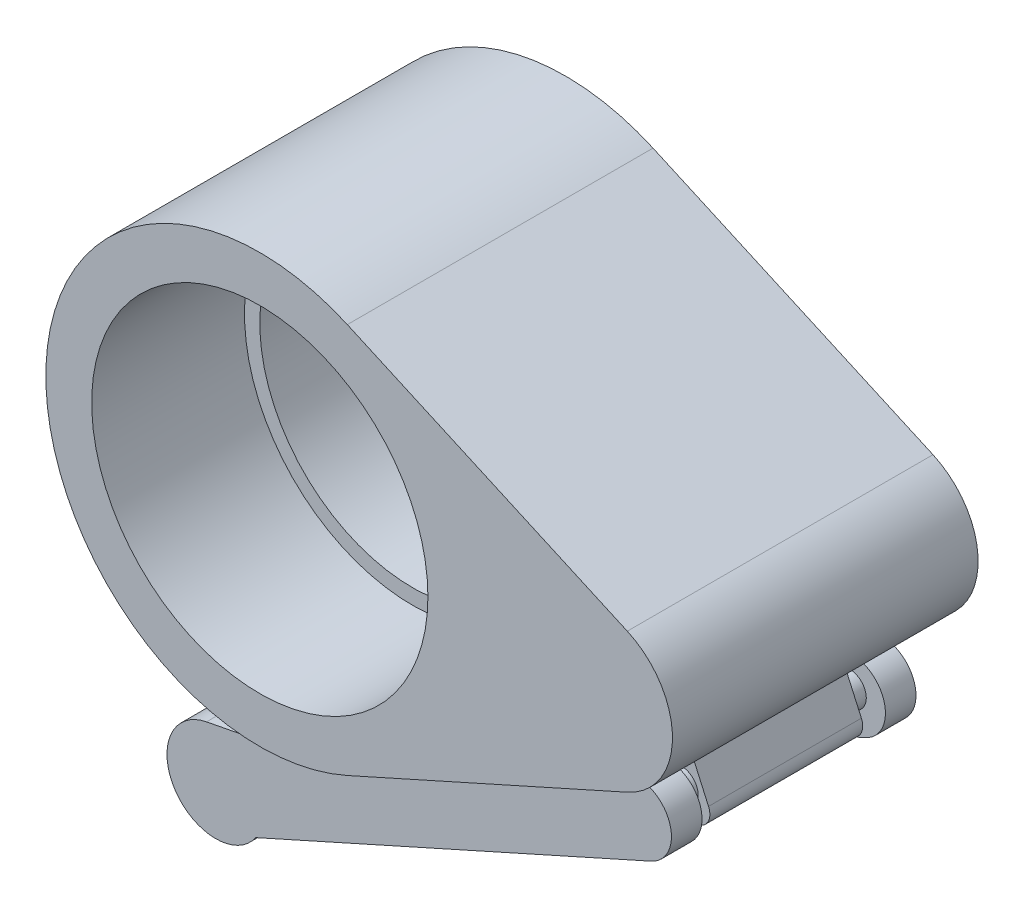
ISO-10303-21;
HEADER;
FILE_DESCRIPTION(('STEP AP214'),'2;1');
FILE_NAME('part.step','',(''),(''),'','','');
FILE_SCHEMA(('AUTOMOTIVE_DESIGN { 1 0 10303 214 1 1 1 1 }'));
ENDSEC;
DATA;
#1=APPLICATION_CONTEXT('core data for automotive mechanical design processes');
#2=APPLICATION_PROTOCOL_DEFINITION('international standard','automotive_design',2000,#1);
#3=PRODUCT_CONTEXT('',#1,'mechanical');
#4=PRODUCT('Part','Part','',(#3));
#5=PRODUCT_RELATED_PRODUCT_CATEGORY('part','',(#4));
#6=PRODUCT_DEFINITION_FORMATION('','',#4);
#7=PRODUCT_DEFINITION_CONTEXT('part definition',#1,'design');
#8=PRODUCT_DEFINITION('design','',#6,#7);
#9=PRODUCT_DEFINITION_SHAPE('','',#8);
#10=(LENGTH_UNIT() NAMED_UNIT(*) SI_UNIT(.MILLI.,.METRE.));
#11=(NAMED_UNIT(*) PLANE_ANGLE_UNIT() SI_UNIT($,.RADIAN.));
#12=(NAMED_UNIT(*) SI_UNIT($,.STERADIAN.) SOLID_ANGLE_UNIT());
#13=UNCERTAINTY_MEASURE_WITH_UNIT(LENGTH_MEASURE(1.E-05),#10,'distance_accuracy_value','');
#14=(GEOMETRIC_REPRESENTATION_CONTEXT(3) GLOBAL_UNCERTAINTY_ASSIGNED_CONTEXT((#13)) GLOBAL_UNIT_ASSIGNED_CONTEXT((#10,
#11,#12)) REPRESENTATION_CONTEXT('',''));
#15=CARTESIAN_POINT('',(0.,0.,0.));
#16=DIRECTION('',(0.,0.,1.));
#17=DIRECTION('',(1.,0.,0.));
#18=AXIS2_PLACEMENT_3D('',#15,#16,#17);
#19=CARTESIAN_POINT('',(5.72727272727273,-12.7749108453812,20.));
#20=DIRECTION('',(-0.409090909090909,0.912493631812942,0.));
#21=DIRECTION('',(-0.912493631812942,-0.409090909090909,0.));
#22=AXIS2_PLACEMENT_3D('',#19,#20,#21);
#23=PLANE('',#22);
#24=DIRECTION('',(0.,0.,-1.));
#25=VECTOR('',#24,1.);
#26=CARTESIAN_POINT('',(20.3954800182028,-6.19883179542836,15.));
#27=LINE('',#26,#25);
#28=CARTESIAN_POINT('',(20.3954800182028,-6.19883179542836,15.));
#29=VERTEX_POINT('',#28);
#30=CARTESIAN_POINT('',(20.3954800182028,-6.19883179542835,5.));
#31=VERTEX_POINT('',#30);
#32=EDGE_CURVE('E285',#29,#31,#27,.T.);
#33=ORIENTED_EDGE('',*,*,#32,.F.);
#34=DIRECTION('',(-0.912493631812942,-0.40909090909091,0.));
#35=VECTOR('',#34,1.);
#36=CARTESIAN_POINT('',(20.3954800182028,-6.19883179542836,15.));
#37=LINE('',#36,#35);
#38=CARTESIAN_POINT('',(23.1329609136416,-4.97155906815563,15.));
#39=VERTEX_POINT('',#38);
#40=EDGE_CURVE('E287',#39,#29,#37,.T.);
#41=ORIENTED_EDGE('',*,*,#40,.F.);
#42=DIRECTION('',(0.,0.,1.));
#43=VECTOR('',#42,1.);
#44=CARTESIAN_POINT('',(23.1329609136416,-4.97155906815563,15.));
#45=LINE('',#44,#43);
#46=CARTESIAN_POINT('',(23.1329609136416,-4.97155906815563,5.));
#47=VERTEX_POINT('',#46);
#48=EDGE_CURVE('E299',#47,#39,#45,.T.);
#49=ORIENTED_EDGE('',*,*,#48,.F.);
#50=DIRECTION('',(0.912493631812942,0.40909090909091,0.));
#51=VECTOR('',#50,1.);
#52=CARTESIAN_POINT('',(20.3954800182028,-6.19883179542836,5.));
#53=LINE('',#52,#51);
#54=EDGE_CURVE('E293',#31,#47,#53,.T.);
#55=ORIENTED_EDGE('',*,*,#54,.F.);
#56=EDGE_LOOP('',(#33,#41,#49,#55));
#57=FACE_BOUND('',#56,.T.);
#58=DIRECTION('',(0.,0.,-1.));
#59=VECTOR('',#58,1.);
#60=CARTESIAN_POINT('',(19.4829863863898,-6.60792270451926,18.));
#61=LINE('',#60,#59);
#62=CARTESIAN_POINT('',(19.4829863863898,-6.60792270451926,16.));
#63=VERTEX_POINT('',#62);
#64=CARTESIAN_POINT('',(19.4829863863898,-6.60792270451926,4.));
#65=VERTEX_POINT('',#64);
#66=EDGE_CURVE('E246',#63,#65,#61,.T.);
#67=ORIENTED_EDGE('',*,*,#66,.T.);
#68=DIRECTION('',(0.912493631812942,0.409090909090909,0.));
#69=VECTOR('',#68,1.);
#70=CARTESIAN_POINT('',(5.72727272727273,-12.7749108453812,4.));
#71=LINE('',#70,#69);
#72=CARTESIAN_POINT('',(21.7642204659222,-5.58519543179199,4.));
#73=VERTEX_POINT('',#72);
#74=EDGE_CURVE('E230',#65,#73,#71,.T.);
#75=ORIENTED_EDGE('',*,*,#74,.T.);
#76=DIRECTION('',(0.,0.,1.));
#77=VECTOR('',#76,1.);
#78=CARTESIAN_POINT('',(21.7642204659222,-5.58519543179199,2.));
#79=LINE('',#78,#77);
#80=CARTESIAN_POINT('',(21.7642204659222,-5.58519543179199,2.));
#81=VERTEX_POINT('',#80);
#82=EDGE_CURVE('E232',#81,#73,#79,.T.);
#83=ORIENTED_EDGE('',*,*,#82,.F.);
#84=DIRECTION('',(0.912493631812942,0.409090909090909,0.));
#85=VECTOR('',#84,1.);
#86=CARTESIAN_POINT('',(5.72727272727273,-12.7749108453812,2.));
#87=LINE('',#86,#85);
#88=CARTESIAN_POINT('',(5.72727272727273,-12.7749108453812,2.));
#89=VERTEX_POINT('',#88);
#90=EDGE_CURVE('E210',#89,#81,#87,.T.);
#91=ORIENTED_EDGE('',*,*,#90,.F.);
#92=DIRECTION('',(0.,0.,-1.));
#93=VECTOR('',#92,1.);
#94=CARTESIAN_POINT('',(5.72727272727273,-12.7749108453812,20.));
#95=LINE('',#94,#93);
#96=CARTESIAN_POINT('',(5.72727272727273,-12.7749108453812,0.));
#97=VERTEX_POINT('',#96);
#98=EDGE_CURVE('E349',#89,#97,#95,.T.);
#99=ORIENTED_EDGE('',*,*,#98,.T.);
#100=DIRECTION('',(0.912493631812942,0.409090909090909,0.));
#101=VECTOR('',#100,1.);
#102=CARTESIAN_POINT('',(5.72727272727273,-12.7749108453812,0.));
#103=LINE('',#102,#101);
#104=CARTESIAN_POINT('',(24.0454545454545,-4.56246815906471,0.));
#105=VERTEX_POINT('',#104);
#106=EDGE_CURVE('E336',#97,#105,#103,.T.);
#107=ORIENTED_EDGE('',*,*,#106,.T.);
#108=DIRECTION('',(0.,0.,-1.));
#109=VECTOR('',#108,1.);
#110=CARTESIAN_POINT('',(24.0454545454545,-4.56246815906471,20.));
#111=LINE('',#110,#109);
#112=CARTESIAN_POINT('',(24.0454545454545,-4.56246815906471,20.));
#113=VERTEX_POINT('',#112);
#114=EDGE_CURVE('E347',#113,#105,#111,.T.);
#115=ORIENTED_EDGE('',*,*,#114,.F.);
#116=DIRECTION('',(0.912493631812942,0.409090909090909,0.));
#117=VECTOR('',#116,1.);
#118=CARTESIAN_POINT('',(5.72727272727273,-12.7749108453812,20.));
#119=LINE('',#118,#117);
#120=CARTESIAN_POINT('',(5.72727272727273,-12.7749108453812,20.));
#121=VERTEX_POINT('',#120);
#122=EDGE_CURVE('E326',#121,#113,#119,.T.);
#123=ORIENTED_EDGE('',*,*,#122,.F.);
#124=CARTESIAN_POINT('',(5.72727272727273,-12.7749108453812,18.));
#125=VERTEX_POINT('',#124);
#126=EDGE_CURVE('E348',#121,#125,#95,.T.);
#127=ORIENTED_EDGE('',*,*,#126,.T.);
#128=DIRECTION('',(0.912493631812942,0.409090909090909,0.));
#129=VECTOR('',#128,1.);
#130=CARTESIAN_POINT('',(5.72727272727273,-12.7749108453812,18.));
#131=LINE('',#130,#129);
#132=CARTESIAN_POINT('',(21.7642204659222,-5.58519543179199,18.));
#133=VERTEX_POINT('',#132);
#134=EDGE_CURVE('E265',#125,#133,#131,.T.);
#135=ORIENTED_EDGE('',*,*,#134,.T.);
#136=DIRECTION('',(0.,0.,-1.));
#137=VECTOR('',#136,1.);
#138=CARTESIAN_POINT('',(21.7642204659222,-5.58519543179199,18.));
#139=LINE('',#138,#137);
#140=CARTESIAN_POINT('',(21.7642204659222,-5.58519543179199,16.));
#141=VERTEX_POINT('',#140);
#142=EDGE_CURVE('E262',#133,#141,#139,.T.);
#143=ORIENTED_EDGE('',*,*,#142,.T.);
#144=DIRECTION('',(0.912493631812942,0.409090909090909,0.));
#145=VECTOR('',#144,1.);
#146=CARTESIAN_POINT('',(5.72727272727273,-12.7749108453812,16.));
#147=LINE('',#146,#145);
#148=EDGE_CURVE('E269',#63,#141,#147,.T.);
#149=ORIENTED_EDGE('',*,*,#148,.F.);
#150=EDGE_LOOP('',(#67,#75,#83,#91,#99,#107,#115,#123,#127,#135,#143,#149));
#151=FACE_BOUND('',#150,.T.);
#152=ADVANCED_FACE('F41',(#57,#151),#23,.F.);
#153=CARTESIAN_POINT('',(0.,0.,20.));
#154=DIRECTION('',(0.,0.,-1.));
#155=DIRECTION('',(-1.,0.,0.));
#156=AXIS2_PLACEMENT_3D('',#153,#154,#155);
#157=CYLINDRICAL_SURFACE('',#156,10.);
#158=CARTESIAN_POINT('',(0.,0.,0.));
#159=DIRECTION('',(0.,0.,1.));
#160=DIRECTION('',(1.,0.,0.));
#161=AXIS2_PLACEMENT_3D('',#158,#159,#160);
#162=CIRCLE('',#161,10.);
#163=CARTESIAN_POINT('',(10.,0.,0.));
#164=VERTEX_POINT('',#163);
#165=EDGE_CURVE('E320',#164,#164,#162,.T.);
#166=ORIENTED_EDGE('',*,*,#165,.F.);
#167=EDGE_LOOP('',(#166));
#168=FACE_BOUND('',#167,.T.);
#169=CARTESIAN_POINT('',(0.,0.,10.));
#170=DIRECTION('',(0.,0.,1.));
#171=DIRECTION('',(1.,0.,0.));
#172=AXIS2_PLACEMENT_3D('',#169,#170,#171);
#173=CIRCLE('',#172,10.);
#174=CARTESIAN_POINT('',(10.,0.,10.));
#175=VERTEX_POINT('',#174);
#176=EDGE_CURVE('E309',#175,#175,#173,.T.);
#177=ORIENTED_EDGE('',*,*,#176,.T.);
#178=EDGE_LOOP('',(#177));
#179=FACE_BOUND('',#178,.T.);
#180=ADVANCED_FACE('F394',(#168,#179),#157,.F.);
#181=CARTESIAN_POINT('',(0.,0.,20.));
#182=DIRECTION('',(0.,0.,1.));
#183=DIRECTION('',(1.,0.,0.));
#184=AXIS2_PLACEMENT_3D('',#181,#182,#183);
#185=PLANE('',#184);
#186=CARTESIAN_POINT('',(0.,0.,20.));
#187=DIRECTION('',(0.,0.,1.));
#188=DIRECTION('',(1.,0.,0.));
#189=AXIS2_PLACEMENT_3D('',#186,#187,#188);
#190=CIRCLE('',#189,11.);
#191=CARTESIAN_POINT('',(11.,0.,20.));
#192=VERTEX_POINT('',#191);
#193=EDGE_CURVE('E311',#192,#192,#190,.T.);
#194=ORIENTED_EDGE('',*,*,#193,.F.);
#195=EDGE_LOOP('',(#194));
#196=FACE_BOUND('',#195,.T.);
#197=CARTESIAN_POINT('',(0.,0.,20.));
#198=DIRECTION('',(0.,0.,1.));
#199=DIRECTION('',(1.,0.,0.));
#200=AXIS2_PLACEMENT_3D('',#197,#198,#199);
#201=CIRCLE('',#200,14.);
#202=CARTESIAN_POINT('',(5.72727272727273,12.7749108453812,20.));
#203=VERTEX_POINT('',#202);
#204=EDGE_CURVE('E323',#203,#121,#201,.T.);
#205=ORIENTED_EDGE('',*,*,#204,.T.);
#206=ORIENTED_EDGE('',*,*,#122,.T.);
#207=CARTESIAN_POINT('',(22.,0.,20.));
#208=DIRECTION('',(0.,0.,1.));
#209=DIRECTION('',(1.,0.,0.));
#210=AXIS2_PLACEMENT_3D('',#207,#208,#209);
#211=CIRCLE('',#210,5.);
#212=CARTESIAN_POINT('',(24.0454545454545,4.56246815906471,20.));
#213=VERTEX_POINT('',#212);
#214=EDGE_CURVE('E328',#113,#213,#211,.T.);
#215=ORIENTED_EDGE('',*,*,#214,.T.);
#216=DIRECTION('',(-0.912493631812942,0.409090909090909,0.));
#217=VECTOR('',#216,1.);
#218=CARTESIAN_POINT('',(5.72727272727273,12.7749108453812,20.));
#219=LINE('',#218,#217);
#220=EDGE_CURVE('E332',#213,#203,#219,.T.);
#221=ORIENTED_EDGE('',*,*,#220,.T.);
#222=EDGE_LOOP('',(#205,#206,#215,#221));
#223=FACE_BOUND('',#222,.T.);
#224=ADVANCED_FACE('F402',(#196,#223),#185,.T.);
#225=CARTESIAN_POINT('',(0.,0.,0.));
#226=DIRECTION('',(0.,0.,1.));
#227=DIRECTION('',(1.,0.,0.));
#228=AXIS2_PLACEMENT_3D('',#225,#226,#227);
#229=PLANE('',#228);
#230=CARTESIAN_POINT('',(0.,0.,0.));
#231=DIRECTION('',(0.,0.,1.));
#232=DIRECTION('',(1.,0.,0.));
#233=AXIS2_PLACEMENT_3D('',#230,#231,#232);
#234=CIRCLE('',#233,14.);
#235=CARTESIAN_POINT('',(5.72727272727273,12.7749108453812,0.));
#236=VERTEX_POINT('',#235);
#237=EDGE_CURVE('E325',#236,#97,#234,.T.);
#238=ORIENTED_EDGE('',*,*,#237,.F.);
#239=DIRECTION('',(-0.912493631812942,0.409090909090909,0.));
#240=VECTOR('',#239,1.);
#241=CARTESIAN_POINT('',(5.72727272727273,12.7749108453812,0.));
#242=LINE('',#241,#240);
#243=CARTESIAN_POINT('',(24.0454545454545,4.56246815906471,0.));
#244=VERTEX_POINT('',#243);
#245=EDGE_CURVE('E330',#244,#236,#242,.T.);
#246=ORIENTED_EDGE('',*,*,#245,.F.);
#247=CARTESIAN_POINT('',(22.,0.,0.));
#248=DIRECTION('',(0.,0.,1.));
#249=DIRECTION('',(1.,0.,0.));
#250=AXIS2_PLACEMENT_3D('',#247,#248,#249);
#251=CIRCLE('',#250,5.);
#252=EDGE_CURVE('E339',#105,#244,#251,.T.);
#253=ORIENTED_EDGE('',*,*,#252,.F.);
#254=ORIENTED_EDGE('',*,*,#106,.F.);
#255=EDGE_LOOP('',(#238,#246,#253,#254));
#256=FACE_BOUND('',#255,.T.);
#257=ORIENTED_EDGE('',*,*,#165,.T.);
#258=EDGE_LOOP('',(#257));
#259=FACE_BOUND('',#258,.T.);
#260=ADVANCED_FACE('F413',(#256,#259),#229,.F.);
#261=CARTESIAN_POINT('',(0.,0.,20.));
#262=DIRECTION('',(0.,0.,-1.));
#263=DIRECTION('',(-1.,0.,0.));
#264=AXIS2_PLACEMENT_3D('',#261,#262,#263);
#265=CYLINDRICAL_SURFACE('',#264,14.);
#266=ORIENTED_EDGE('',*,*,#237,.T.);
#267=ORIENTED_EDGE('',*,*,#98,.F.);
#268=EDGE_CURVE('E353',#125,#89,#95,.T.);
#269=ORIENTED_EDGE('',*,*,#268,.F.);
#270=ORIENTED_EDGE('',*,*,#126,.F.);
#271=ORIENTED_EDGE('',*,*,#204,.F.);
#272=DIRECTION('',(0.,0.,-1.));
#273=VECTOR('',#272,1.);
#274=CARTESIAN_POINT('',(5.72727272727273,12.7749108453812,20.));
#275=LINE('',#274,#273);
#276=EDGE_CURVE('E334',#203,#236,#275,.T.);
#277=ORIENTED_EDGE('',*,*,#276,.T.);
#278=EDGE_LOOP('',(#266,#267,#269,#270,#271,#277));
#279=FACE_BOUND('',#278,.T.);
#280=ADVANCED_FACE('F410',(#279),#265,.T.);
#281=CARTESIAN_POINT('',(22.,0.,20.));
#282=DIRECTION('',(0.,0.,-1.));
#283=DIRECTION('',(-1.,0.,0.));
#284=AXIS2_PLACEMENT_3D('',#281,#282,#283);
#285=CYLINDRICAL_SURFACE('',#284,5.);
#286=ORIENTED_EDGE('',*,*,#252,.T.);
#287=DIRECTION('',(0.,0.,-1.));
#288=VECTOR('',#287,1.);
#289=CARTESIAN_POINT('',(24.0454545454545,4.56246815906471,20.));
#290=LINE('',#289,#288);
#291=EDGE_CURVE('E341',#213,#244,#290,.T.);
#292=ORIENTED_EDGE('',*,*,#291,.F.);
#293=ORIENTED_EDGE('',*,*,#214,.F.);
#294=ORIENTED_EDGE('',*,*,#114,.T.);
#295=EDGE_LOOP('',(#286,#292,#293,#294));
#296=FACE_BOUND('',#295,.T.);
#297=ADVANCED_FACE('F409',(#296),#285,.T.);
#298=CARTESIAN_POINT('',(5.72727272727273,12.7749108453812,20.));
#299=DIRECTION('',(-0.409090909090909,-0.912493631812942,0.));
#300=DIRECTION('',(0.912493631812942,-0.409090909090909,0.));
#301=AXIS2_PLACEMENT_3D('',#298,#299,#300);
#302=PLANE('',#301);
#303=ORIENTED_EDGE('',*,*,#245,.T.);
#304=ORIENTED_EDGE('',*,*,#276,.F.);
#305=ORIENTED_EDGE('',*,*,#220,.F.);
#306=ORIENTED_EDGE('',*,*,#291,.T.);
#307=EDGE_LOOP('',(#303,#304,#305,#306));
#308=FACE_BOUND('',#307,.T.);
#309=ADVANCED_FACE('F417',(#308),#302,.F.);
#310=CARTESIAN_POINT('',(0.,0.,10.));
#311=DIRECTION('',(0.,0.,1.));
#312=DIRECTION('',(1.,0.,0.));
#313=AXIS2_PLACEMENT_3D('',#310,#311,#312);
#314=CYLINDRICAL_SURFACE('',#313,11.);
#315=CARTESIAN_POINT('',(0.,0.,10.));
#316=DIRECTION('',(0.,0.,1.));
#317=DIRECTION('',(1.,0.,0.));
#318=AXIS2_PLACEMENT_3D('',#315,#316,#317);
#319=CIRCLE('',#318,11.);
#320=CARTESIAN_POINT('',(11.,0.,10.));
#321=VERTEX_POINT('',#320);
#322=EDGE_CURVE('E314',#321,#321,#319,.T.);
#323=ORIENTED_EDGE('',*,*,#322,.F.);
#324=EDGE_LOOP('',(#323));
#325=FACE_BOUND('',#324,.T.);
#326=ORIENTED_EDGE('',*,*,#193,.T.);
#327=EDGE_LOOP('',(#326));
#328=FACE_BOUND('',#327,.T.);
#329=ADVANCED_FACE('F508',(#325,#328),#314,.F.);
#330=CARTESIAN_POINT('',(0.,0.,10.));
#331=DIRECTION('',(0.,0.,1.));
#332=DIRECTION('',(1.,0.,0.));
#333=AXIS2_PLACEMENT_3D('',#330,#331,#332);
#334=PLANE('',#333);
#335=ORIENTED_EDGE('',*,*,#176,.F.);
#336=EDGE_LOOP('',(#335));
#337=FACE_BOUND('',#336,.T.);
#338=ORIENTED_EDGE('',*,*,#322,.T.);
#339=EDGE_LOOP('',(#338));
#340=FACE_BOUND('',#339,.T.);
#341=ADVANCED_FACE('F504',(#337,#340),#334,.T.);
#342=CARTESIAN_POINT('',(22.0318436545664,-9.84880632268013,15.));
#343=DIRECTION('',(0.912493631812942,0.409090909090909,0.));
#344=DIRECTION('',(-0.409090909090909,0.912493631812942,0.));
#345=AXIS2_PLACEMENT_3D('',#342,#343,#344);
#346=PLANE('',#345);
#347=DIRECTION('',(-0.409090909090909,0.912493631812942,0.));
#348=VECTOR('',#347,1.);
#349=CARTESIAN_POINT('',(22.0318436545664,-9.84880632268013,5.));
#350=LINE('',#349,#348);
#351=CARTESIAN_POINT('',(21.6227527454755,-8.93631269086718,5.));
#352=VERTEX_POINT('',#351);
#353=EDGE_CURVE('E306',#352,#31,#350,.T.);
#354=ORIENTED_EDGE('',*,*,#353,.F.);
#355=DIRECTION('',(0.,0.,-1.));
#356=VECTOR('',#355,1.);
#357=CARTESIAN_POINT('',(21.6227527454755,-8.93631269086718,15.));
#358=LINE('',#357,#356);
#359=CARTESIAN_POINT('',(21.6227527454755,-8.93631269086718,15.));
#360=VERTEX_POINT('',#359);
#361=EDGE_CURVE('E47',#352,#360,#358,.F.);
#362=ORIENTED_EDGE('',*,*,#361,.T.);
#363=DIRECTION('',(-0.409090909090909,0.912493631812942,0.));
#364=VECTOR('',#363,1.);
#365=CARTESIAN_POINT('',(22.0318436545664,-9.84880632268013,15.));
#366=LINE('',#365,#364);
#367=EDGE_CURVE('E295',#360,#29,#366,.T.);
#368=ORIENTED_EDGE('',*,*,#367,.T.);
#369=ORIENTED_EDGE('',*,*,#32,.T.);
#370=EDGE_LOOP('',(#354,#362,#368,#369));
#371=FACE_BOUND('',#370,.T.);
#372=ADVANCED_FACE('F496',(#371),#346,.F.);
#373=CARTESIAN_POINT('',(22.0318436545664,-9.84880632268013,5.));
#374=DIRECTION('',(0.,0.,1.));
#375=DIRECTION('',(1.,0.,0.));
#376=AXIS2_PLACEMENT_3D('',#373,#374,#375);
#377=PLANE('',#376);
#378=CARTESIAN_POINT('',(22.582402284104,-7.41018269541788,5.));
#379=DIRECTION('',(0.,0.,1.));
#380=DIRECTION('',(1.,0.,0.));
#381=AXIS2_PLACEMENT_3D('',#378,#379,#380);
#382=CIRCLE('',#381,1.1);
#383=CARTESIAN_POINT('',(23.682402284104,-7.41018269541788,5.));
#384=VERTEX_POINT('',#383);
#385=EDGE_CURVE('E280',#384,#384,#382,.T.);
#386=ORIENTED_EDGE('',*,*,#385,.T.);
#387=EDGE_LOOP('',(#386));
#388=FACE_BOUND('',#387,.T.);
#389=DIRECTION('',(0.912493631812942,0.40909090909091,0.));
#390=VECTOR('',#389,1.);
#391=CARTESIAN_POINT('',(22.0318436545664,-9.84880632268013,5.));
#392=LINE('',#391,#390);
#393=CARTESIAN_POINT('',(22.9443372863793,-9.43971541358922,5.));
#394=VERTEX_POINT('',#393);
#395=CARTESIAN_POINT('',(23.8568309181923,-9.03062450449831,5.));
#396=VERTEX_POINT('',#395);
#397=EDGE_CURVE('E288',#394,#396,#392,.T.);
#398=ORIENTED_EDGE('',*,*,#397,.F.);
#399=CARTESIAN_POINT('',(22.5352463772884,-8.52722178177628,5.));
#400=DIRECTION('',(0.,0.,1.));
#401=DIRECTION('',(1.,0.,0.));
#402=AXIS2_PLACEMENT_3D('',#399,#400,#401);
#403=CIRCLE('',#402,1.);
#404=EDGE_CURVE('E64',#394,#352,#403,.F.);
#405=ORIENTED_EDGE('',*,*,#404,.T.);
#406=ORIENTED_EDGE('',*,*,#353,.T.);
#407=ORIENTED_EDGE('',*,*,#54,.T.);
#408=DIRECTION('',(-0.409090909090909,0.912493631812942,0.));
#409=VECTOR('',#408,1.);
#410=CARTESIAN_POINT('',(24.7693245500052,-8.6215335954074,5.));
#411=LINE('',#410,#409);
#412=CARTESIAN_POINT('',(24.3602336409143,-7.70903996359446,5.));
#413=VERTEX_POINT('',#412);
#414=EDGE_CURVE('E308',#413,#47,#411,.T.);
#415=ORIENTED_EDGE('',*,*,#414,.F.);
#416=CARTESIAN_POINT('',(23.4477400091014,-8.11813087268537,5.));
#417=DIRECTION('',(0.,0.,1.));
#418=DIRECTION('',(1.,0.,0.));
#419=AXIS2_PLACEMENT_3D('',#416,#417,#418);
#420=CIRCLE('',#419,1.);
#421=EDGE_CURVE('E365',#413,#396,#420,.F.);
#422=ORIENTED_EDGE('',*,*,#421,.T.);
#423=EDGE_LOOP('',(#398,#405,#406,#407,#415,#422));
#424=FACE_BOUND('',#423,.T.);
#425=ADVANCED_FACE('F376',(#388,#424),#377,.F.);
#426=CARTESIAN_POINT('',(24.7693245500052,-8.6215335954074,15.));
#427=DIRECTION('',(-0.912493631812942,-0.409090909090909,0.));
#428=DIRECTION('',(0.409090909090909,-0.912493631812942,0.));
#429=AXIS2_PLACEMENT_3D('',#426,#427,#428);
#430=PLANE('',#429);
#431=DIRECTION('',(-0.409090909090909,0.912493631812942,0.));
#432=VECTOR('',#431,1.);
#433=CARTESIAN_POINT('',(24.7693245500052,-8.6215335954074,15.));
#434=LINE('',#433,#432);
#435=CARTESIAN_POINT('',(24.3602336409143,-7.70903996359446,15.));
#436=VERTEX_POINT('',#435);
#437=EDGE_CURVE('E302',#436,#39,#434,.T.);
#438=ORIENTED_EDGE('',*,*,#437,.F.);
#439=DIRECTION('',(0.,0.,1.));
#440=VECTOR('',#439,1.);
#441=CARTESIAN_POINT('',(24.3602336409143,-7.70903996359446,5.));
#442=LINE('',#441,#440);
#443=EDGE_CURVE('E362',#436,#413,#442,.F.);
#444=ORIENTED_EDGE('',*,*,#443,.T.);
#445=ORIENTED_EDGE('',*,*,#414,.T.);
#446=ORIENTED_EDGE('',*,*,#48,.T.);
#447=EDGE_LOOP('',(#438,#444,#445,#446));
#448=FACE_BOUND('',#447,.T.);
#449=ADVANCED_FACE('F495',(#448),#430,.F.);
#450=CARTESIAN_POINT('',(22.0318436545664,-9.84880632268013,15.));
#451=DIRECTION('',(0.,0.,-1.));
#452=DIRECTION('',(-1.,0.,0.));
#453=AXIS2_PLACEMENT_3D('',#450,#451,#452);
#454=PLANE('',#453);
#455=CARTESIAN_POINT('',(22.582402284104,-7.41018269541788,15.));
#456=DIRECTION('',(0.,0.,-1.));
#457=DIRECTION('',(-1.,0.,0.));
#458=AXIS2_PLACEMENT_3D('',#455,#456,#457);
#459=CIRCLE('',#458,1.1);
#460=CARTESIAN_POINT('',(21.482402284104,-7.41018269541788,15.));
#461=VERTEX_POINT('',#460);
#462=EDGE_CURVE('E354',#461,#461,#459,.F.);
#463=ORIENTED_EDGE('',*,*,#462,.F.);
#464=EDGE_LOOP('',(#463));
#465=FACE_BOUND('',#464,.T.);
#466=ORIENTED_EDGE('',*,*,#367,.F.);
#467=CARTESIAN_POINT('',(22.5352463772884,-8.52722178177628,15.));
#468=DIRECTION('',(0.,0.,-1.));
#469=DIRECTION('',(-1.,0.,0.));
#470=AXIS2_PLACEMENT_3D('',#467,#468,#469);
#471=CIRCLE('',#470,1.);
#472=CARTESIAN_POINT('',(22.9443372863793,-9.43971541358922,15.));
#473=VERTEX_POINT('',#472);
#474=EDGE_CURVE('E11',#360,#473,#471,.F.);
#475=ORIENTED_EDGE('',*,*,#474,.T.);
#476=DIRECTION('',(-0.912493631812942,-0.40909090909091,0.));
#477=VECTOR('',#476,1.);
#478=CARTESIAN_POINT('',(22.0318436545664,-9.84880632268013,15.));
#479=LINE('',#478,#477);
#480=CARTESIAN_POINT('',(23.8568309181923,-9.03062450449831,15.));
#481=VERTEX_POINT('',#480);
#482=EDGE_CURVE('E286',#481,#473,#479,.T.);
#483=ORIENTED_EDGE('',*,*,#482,.F.);
#484=CARTESIAN_POINT('',(23.4477400091014,-8.11813087268537,15.));
#485=DIRECTION('',(0.,0.,-1.));
#486=DIRECTION('',(-1.,0.,0.));
#487=AXIS2_PLACEMENT_3D('',#484,#485,#486);
#488=CIRCLE('',#487,1.);
#489=EDGE_CURVE('E359',#481,#436,#488,.F.);
#490=ORIENTED_EDGE('',*,*,#489,.T.);
#491=ORIENTED_EDGE('',*,*,#437,.T.);
#492=ORIENTED_EDGE('',*,*,#40,.T.);
#493=EDGE_LOOP('',(#466,#475,#483,#490,#491,#492));
#494=FACE_BOUND('',#493,.T.);
#495=ADVANCED_FACE('F383',(#465,#494),#454,.F.);
#496=CARTESIAN_POINT('',(7.36363636363638,-16.424885372633,0.));
#497=DIRECTION('',(0.40909090909091,-0.912493631812942,0.));
#498=DIRECTION('',(0.912493631812942,0.40909090909091,0.));
#499=AXIS2_PLACEMENT_3D('',#496,#497,#498);
#500=PLANE('',#499);
#501=ORIENTED_EDGE('',*,*,#482,.T.);
#502=DIRECTION('',(0.,0.,-1.));
#503=VECTOR('',#502,1.);
#504=CARTESIAN_POINT('',(22.9443372863793,-9.43971541358922,5.));
#505=LINE('',#504,#503);
#506=EDGE_CURVE('E370',#473,#394,#505,.T.);
#507=ORIENTED_EDGE('',*,*,#506,.T.);
#508=ORIENTED_EDGE('',*,*,#397,.T.);
#509=DIRECTION('',(0.,0.,1.));
#510=VECTOR('',#509,1.);
#511=CARTESIAN_POINT('',(23.8568309181923,-9.03062450449831,15.));
#512=LINE('',#511,#510);
#513=EDGE_CURVE('E360',#396,#481,#512,.T.);
#514=ORIENTED_EDGE('',*,*,#513,.T.);
#515=EDGE_LOOP('',(#501,#507,#508,#514));
#516=FACE_BOUND('',#515,.T.);
#517=ADVANCED_FACE('F375',(#516),#500,.T.);
#518=CARTESIAN_POINT('',(22.582402284104,-7.41018269541788,16.));
#519=DIRECTION('',(0.,0.,-1.));
#520=DIRECTION('',(-1.,0.,0.));
#521=AXIS2_PLACEMENT_3D('',#518,#519,#520);
#522=CYLINDRICAL_SURFACE('',#521,1.1);
#523=CARTESIAN_POINT('',(22.582402284104,-7.41018269541788,16.));
#524=DIRECTION('',(0.,0.,1.));
#525=DIRECTION('',(1.,0.,0.));
#526=AXIS2_PLACEMENT_3D('',#523,#524,#525);
#527=CIRCLE('',#526,1.1);
#528=CARTESIAN_POINT('',(23.682402284104,-7.41018269541788,16.));
#529=VERTEX_POINT('',#528);
#530=EDGE_CURVE('E282',#529,#529,#527,.T.);
#531=ORIENTED_EDGE('',*,*,#530,.F.);
#532=EDGE_LOOP('',(#531));
#533=FACE_BOUND('',#532,.T.);
#534=ORIENTED_EDGE('',*,*,#462,.T.);
#535=EDGE_LOOP('',(#534));
#536=FACE_BOUND('',#535,.T.);
#537=ADVANCED_FACE('F482',(#533,#536),#522,.T.);
#538=CARTESIAN_POINT('',(22.582402284104,-7.41018269541788,4.));
#539=DIRECTION('',(0.,0.,1.));
#540=DIRECTION('',(1.,0.,0.));
#541=AXIS2_PLACEMENT_3D('',#538,#539,#540);
#542=CYLINDRICAL_SURFACE('',#541,1.1);
#543=CARTESIAN_POINT('',(22.582402284104,-7.41018269541788,4.));
#544=DIRECTION('',(0.,0.,1.));
#545=DIRECTION('',(1.,0.,0.));
#546=AXIS2_PLACEMENT_3D('',#543,#544,#545);
#547=CIRCLE('',#546,1.1);
#548=CARTESIAN_POINT('',(23.682402284104,-7.41018269541788,4.));
#549=VERTEX_POINT('',#548);
#550=EDGE_CURVE('E240',#549,#549,#547,.T.);
#551=ORIENTED_EDGE('',*,*,#550,.T.);
#552=EDGE_LOOP('',(#551));
#553=FACE_BOUND('',#552,.T.);
#554=ORIENTED_EDGE('',*,*,#385,.F.);
#555=EDGE_LOOP('',(#554));
#556=FACE_BOUND('',#555,.T.);
#557=ADVANCED_FACE('F485',(#553,#556),#542,.T.);
#558=CARTESIAN_POINT('',(0.,0.,16.));
#559=DIRECTION('',(0.,0.,1.));
#560=DIRECTION('',(1.,0.,0.));
#561=AXIS2_PLACEMENT_3D('',#558,#559,#560);
#562=PLANE('',#561);
#563=DIRECTION('',(-0.912493631812942,-0.409090909090909,0.));
#564=VECTOR('',#563,1.);
#565=CARTESIAN_POINT('',(7.56818181818182,-16.8811321885394,16.));
#566=LINE('',#565,#564);
#567=CARTESIAN_POINT('',(23.6051295568313,-9.69141677495023,16.));
#568=VERTEX_POINT('',#567);
#569=CARTESIAN_POINT('',(21.3238954772989,-10.7141440476775,16.));
#570=VERTEX_POINT('',#569);
#571=EDGE_CURVE('E258',#568,#570,#566,.T.);
#572=ORIENTED_EDGE('',*,*,#571,.T.);
#573=DIRECTION('',(0.40909090909091,-0.912493631812942,0.));
#574=VECTOR('',#573,1.);
#575=CARTESIAN_POINT('',(13.7557136591171,6.16698814086194,16.));
#576=LINE('',#575,#574);
#577=EDGE_CURVE('E259',#63,#570,#576,.T.);
#578=ORIENTED_EDGE('',*,*,#577,.F.);
#579=ORIENTED_EDGE('',*,*,#148,.T.);
#580=CARTESIAN_POINT('',(22.6846750113767,-7.63830610337111,16.));
#581=DIRECTION('',(0.,0.,1.));
#582=DIRECTION('',(1.,0.,0.));
#583=AXIS2_PLACEMENT_3D('',#580,#581,#582);
#584=CIRCLE('',#583,2.25);
#585=EDGE_CURVE('E270',#141,#568,#584,.F.);
#586=ORIENTED_EDGE('',*,*,#585,.T.);
#587=EDGE_LOOP('',(#572,#578,#579,#586));
#588=FACE_BOUND('',#587,.T.);
#589=ORIENTED_EDGE('',*,*,#530,.T.);
#590=EDGE_LOOP('',(#589));
#591=FACE_BOUND('',#590,.T.);
#592=ADVANCED_FACE('F470',(#588,#591),#562,.F.);
#593=CARTESIAN_POINT('',(7.56818181818182,-16.8811321885394,18.));
#594=DIRECTION('',(0.409090909090909,-0.912493631812942,0.));
#595=DIRECTION('',(0.912493631812942,0.409090909090909,0.));
#596=AXIS2_PLACEMENT_3D('',#593,#594,#595);
#597=PLANE('',#596);
#598=ORIENTED_EDGE('',*,*,#571,.F.);
#599=DIRECTION('',(0.,0.,-1.));
#600=VECTOR('',#599,1.);
#601=CARTESIAN_POINT('',(23.6051295568313,-9.69141677495023,18.));
#602=LINE('',#601,#600);
#603=CARTESIAN_POINT('',(23.6051295568313,-9.69141677495023,18.));
#604=VERTEX_POINT('',#603);
#605=EDGE_CURVE('E274',#604,#568,#602,.T.);
#606=ORIENTED_EDGE('',*,*,#605,.F.);
#607=DIRECTION('',(-0.912493631812942,-0.409090909090909,0.));
#608=VECTOR('',#607,1.);
#609=CARTESIAN_POINT('',(7.56818181818182,-16.8811321885394,18.));
#610=LINE('',#609,#608);
#611=CARTESIAN_POINT('',(-2.26015364866721,-21.2873905456475,18.));
#612=VERTEX_POINT('',#611);
#613=EDGE_CURVE('E188',#604,#612,#610,.T.);
#614=ORIENTED_EDGE('',*,*,#613,.T.);
#615=DIRECTION('',(0.,0.,-1.));
#616=VECTOR('',#615,1.);
#617=CARTESIAN_POINT('',(-2.26015364866721,-21.2873905456475,18.));
#618=LINE('',#617,#616);
#619=CARTESIAN_POINT('',(-2.26015364866721,-21.2873905456475,2.));
#620=VERTEX_POINT('',#619);
#621=EDGE_CURVE('E185',#612,#620,#618,.T.);
#622=ORIENTED_EDGE('',*,*,#621,.T.);
#623=DIRECTION('',(-0.912493631812942,-0.409090909090909,0.));
#624=VECTOR('',#623,1.);
#625=CARTESIAN_POINT('',(7.56818181818182,-16.8811321885394,2.));
#626=LINE('',#625,#624);
#627=CARTESIAN_POINT('',(23.6051295568313,-9.69141677495023,2.));
#628=VERTEX_POINT('',#627);
#629=EDGE_CURVE('E187',#628,#620,#626,.T.);
#630=ORIENTED_EDGE('',*,*,#629,.F.);
#631=DIRECTION('',(0.,0.,1.));
#632=VECTOR('',#631,1.);
#633=CARTESIAN_POINT('',(23.6051295568313,-9.69141677495023,2.));
#634=LINE('',#633,#632);
#635=CARTESIAN_POINT('',(23.6051295568313,-9.69141677495023,4.));
#636=VERTEX_POINT('',#635);
#637=EDGE_CURVE('E221',#628,#636,#634,.T.);
#638=ORIENTED_EDGE('',*,*,#637,.T.);
#639=DIRECTION('',(-0.912493631812942,-0.409090909090909,0.));
#640=VECTOR('',#639,1.);
#641=CARTESIAN_POINT('',(7.56818181818182,-16.8811321885394,4.));
#642=LINE('',#641,#640);
#643=CARTESIAN_POINT('',(21.3238954772989,-10.7141440476775,4.));
#644=VERTEX_POINT('',#643);
#645=EDGE_CURVE('E219',#636,#644,#642,.T.);
#646=ORIENTED_EDGE('',*,*,#645,.T.);
#647=DIRECTION('',(0.,0.,-1.));
#648=VECTOR('',#647,1.);
#649=CARTESIAN_POINT('',(21.3238954772989,-10.7141440476775,18.));
#650=LINE('',#649,#648);
#651=EDGE_CURVE('E194',#570,#644,#650,.T.);
#652=ORIENTED_EDGE('',*,*,#651,.F.);
#653=EDGE_LOOP('',(#598,#606,#614,#622,#630,#638,#646,#652));
#654=FACE_BOUND('',#653,.T.);
#655=ADVANCED_FACE('F183',(#654),#597,.T.);
#656=CARTESIAN_POINT('',(22.6846750113767,-7.63830610337111,18.));
#657=DIRECTION('',(0.,0.,-1.));
#658=DIRECTION('',(-1.,0.,0.));
#659=AXIS2_PLACEMENT_3D('',#656,#657,#658);
#660=CYLINDRICAL_SURFACE('',#659,2.25);
#661=ORIENTED_EDGE('',*,*,#585,.F.);
#662=ORIENTED_EDGE('',*,*,#142,.F.);
#663=CARTESIAN_POINT('',(22.6846750113767,-7.63830610337111,18.));
#664=DIRECTION('',(0.,0.,1.));
#665=DIRECTION('',(1.,0.,0.));
#666=AXIS2_PLACEMENT_3D('',#663,#664,#665);
#667=CIRCLE('',#666,2.25);
#668=EDGE_CURVE('E256',#133,#604,#667,.F.);
#669=ORIENTED_EDGE('',*,*,#668,.T.);
#670=ORIENTED_EDGE('',*,*,#605,.T.);
#671=EDGE_LOOP('',(#661,#662,#669,#670));
#672=FACE_BOUND('',#671,.T.);
#673=ADVANCED_FACE('F473',(#672),#660,.T.);
#674=CARTESIAN_POINT('',(0.,0.,18.));
#675=DIRECTION('',(0.,0.,1.));
#676=DIRECTION('',(1.,0.,0.));
#677=AXIS2_PLACEMENT_3D('',#674,#675,#676);
#678=PLANE('',#677);
#679=ORIENTED_EDGE('',*,*,#613,.F.);
#680=ORIENTED_EDGE('',*,*,#668,.F.);
#681=ORIENTED_EDGE('',*,*,#134,.F.);
#682=DIRECTION('',(0.912493631812942,0.409090909090909,0.));
#683=VECTOR('',#682,1.);
#684=CARTESIAN_POINT('',(5.72727272727273,-12.7749108453812,18.));
#685=LINE('',#684,#683);
#686=CARTESIAN_POINT('',(1.28372725446931,-14.767049742224,18.));
#687=VERTEX_POINT('',#686);
#688=EDGE_CURVE('E236',#687,#125,#685,.T.);
#689=ORIENTED_EDGE('',*,*,#688,.F.);
#690=CARTESIAN_POINT('',(-2.80718183643978,-5.6421134240946,18.));
#691=DIRECTION('',(0.,0.,1.));
#692=DIRECTION('',(1.,0.,0.));
#693=AXIS2_PLACEMENT_3D('',#690,#691,#692);
#694=CIRCLE('',#693,10.);
#695=CARTESIAN_POINT('',(-0.920349818273805,-15.4624935050906,18.));
#696=VERTEX_POINT('',#695);
#697=EDGE_CURVE('E241',#687,#696,#694,.F.);
#698=ORIENTED_EDGE('',*,*,#697,.T.);
#699=DIRECTION('',(0.982038008099604,0.188683201816597,0.));
#700=VECTOR('',#699,1.);
#701=CARTESIAN_POINT('',(2.83234274503935,-14.7414724830535,18.));
#702=LINE('',#701,#700);
#703=CARTESIAN_POINT('',(-5.48465961070027,-16.3394540489951,18.));
#704=VERTEX_POINT('',#703);
#705=EDGE_CURVE('E244',#704,#696,#702,.T.);
#706=ORIENTED_EDGE('',*,*,#705,.F.);
#707=CARTESIAN_POINT('',(-4.88281120077143,-19.4718898354035,18.));
#708=DIRECTION('',(0.,0.,1.));
#709=DIRECTION('',(1.,0.,0.));
#710=AXIS2_PLACEMENT_3D('',#707,#708,#709);
#711=CIRCLE('',#710,3.18972968517803);
#712=EDGE_CURVE('E248',#612,#704,#711,.F.);
#713=ORIENTED_EDGE('',*,*,#712,.F.);
#714=EDGE_LOOP('',(#679,#680,#681,#689,#698,#706,#713));
#715=FACE_BOUND('',#714,.T.);
#716=ADVANCED_FACE('F441',(#715),#678,.T.);
#717=CARTESIAN_POINT('',(13.7557136591171,6.16698814086194,18.));
#718=DIRECTION('',(0.912493631812942,0.40909090909091,0.));
#719=DIRECTION('',(-0.40909090909091,0.912493631812942,0.));
#720=AXIS2_PLACEMENT_3D('',#717,#718,#719);
#721=PLANE('',#720);
#722=ORIENTED_EDGE('',*,*,#577,.T.);
#723=ORIENTED_EDGE('',*,*,#651,.T.);
#724=DIRECTION('',(0.40909090909091,-0.912493631812942,0.));
#725=VECTOR('',#724,1.);
#726=CARTESIAN_POINT('',(13.7557136591171,6.16698814086194,4.));
#727=LINE('',#726,#725);
#728=EDGE_CURVE('E227',#65,#644,#727,.T.);
#729=ORIENTED_EDGE('',*,*,#728,.F.);
#730=ORIENTED_EDGE('',*,*,#66,.F.);
#731=EDGE_LOOP('',(#722,#723,#729,#730));
#732=FACE_BOUND('',#731,.T.);
#733=ADVANCED_FACE('F464',(#732),#721,.T.);
#734=CARTESIAN_POINT('',(5.72727272727273,-12.7749108453812,18.));
#735=DIRECTION('',(-0.409090909090909,0.912493631812942,0.));
#736=DIRECTION('',(-0.912493631812942,-0.409090909090909,0.));
#737=AXIS2_PLACEMENT_3D('',#734,#735,#736);
#738=PLANE('',#737);
#739=ORIENTED_EDGE('',*,*,#688,.T.);
#740=ORIENTED_EDGE('',*,*,#268,.T.);
#741=DIRECTION('',(0.912493631812942,0.409090909090909,0.));
#742=VECTOR('',#741,1.);
#743=CARTESIAN_POINT('',(5.72727272727273,-12.7749108453812,2.));
#744=LINE('',#743,#742);
#745=CARTESIAN_POINT('',(1.28372725446931,-14.767049742224,2.));
#746=VERTEX_POINT('',#745);
#747=EDGE_CURVE('E215',#746,#89,#744,.T.);
#748=ORIENTED_EDGE('',*,*,#747,.F.);
#749=DIRECTION('',(0.,0.,-1.));
#750=VECTOR('',#749,1.);
#751=CARTESIAN_POINT('',(1.28372725446931,-14.767049742224,18.));
#752=LINE('',#751,#750);
#753=EDGE_CURVE('E255',#687,#746,#752,.T.);
#754=ORIENTED_EDGE('',*,*,#753,.F.);
#755=EDGE_LOOP('',(#739,#740,#748,#754));
#756=FACE_BOUND('',#755,.T.);
#757=ADVANCED_FACE('F443',(#756),#738,.T.);
#758=CARTESIAN_POINT('',(-2.80718183643978,-5.6421134240946,18.));
#759=DIRECTION('',(0.,0.,-1.));
#760=DIRECTION('',(-1.,0.,0.));
#761=AXIS2_PLACEMENT_3D('',#758,#759,#760);
#762=CYLINDRICAL_SURFACE('',#761,10.);
#763=ORIENTED_EDGE('',*,*,#753,.T.);
#764=CARTESIAN_POINT('',(-2.80718183643978,-5.6421134240946,2.));
#765=DIRECTION('',(0.,0.,1.));
#766=DIRECTION('',(1.,0.,0.));
#767=AXIS2_PLACEMENT_3D('',#764,#765,#766);
#768=CIRCLE('',#767,10.);
#769=CARTESIAN_POINT('',(-0.920349818273805,-15.4624935050906,2.));
#770=VERTEX_POINT('',#769);
#771=EDGE_CURVE('E212',#746,#770,#768,.F.);
#772=ORIENTED_EDGE('',*,*,#771,.T.);
#773=DIRECTION('',(0.,0.,-1.));
#774=VECTOR('',#773,1.);
#775=CARTESIAN_POINT('',(-0.920349818273805,-15.4624935050906,18.));
#776=LINE('',#775,#774);
#777=EDGE_CURVE('E252',#696,#770,#776,.T.);
#778=ORIENTED_EDGE('',*,*,#777,.F.);
#779=ORIENTED_EDGE('',*,*,#697,.F.);
#780=EDGE_LOOP('',(#763,#772,#778,#779));
#781=FACE_BOUND('',#780,.T.);
#782=ADVANCED_FACE('F450',(#781),#762,.F.);
#783=CARTESIAN_POINT('',(2.83234274503935,-14.7414724830535,18.));
#784=DIRECTION('',(-0.188683201816597,0.982038008099604,0.));
#785=DIRECTION('',(-0.982038008099604,-0.188683201816597,0.));
#786=AXIS2_PLACEMENT_3D('',#783,#784,#785);
#787=PLANE('',#786);
#788=ORIENTED_EDGE('',*,*,#777,.T.);
#789=DIRECTION('',(0.982038008099604,0.188683201816597,0.));
#790=VECTOR('',#789,1.);
#791=CARTESIAN_POINT('',(2.83234274503935,-14.7414724830535,2.));
#792=LINE('',#791,#790);
#793=CARTESIAN_POINT('',(-5.48465961070027,-16.3394540489951,2.));
#794=VERTEX_POINT('',#793);
#795=EDGE_CURVE('E211',#794,#770,#792,.T.);
#796=ORIENTED_EDGE('',*,*,#795,.F.);
#797=DIRECTION('',(0.,0.,-1.));
#798=VECTOR('',#797,1.);
#799=CARTESIAN_POINT('',(-5.48465961070027,-16.3394540489951,18.));
#800=LINE('',#799,#798);
#801=EDGE_CURVE('E192',#704,#794,#800,.T.);
#802=ORIENTED_EDGE('',*,*,#801,.F.);
#803=ORIENTED_EDGE('',*,*,#705,.T.);
#804=EDGE_LOOP('',(#788,#796,#802,#803));
#805=FACE_BOUND('',#804,.T.);
#806=ADVANCED_FACE('F451',(#805),#787,.T.);
#807=CARTESIAN_POINT('',(-4.88281120077143,-19.4718898354035,18.));
#808=DIRECTION('',(0.,0.,-1.));
#809=DIRECTION('',(-1.,0.,0.));
#810=AXIS2_PLACEMENT_3D('',#807,#808,#809);
#811=CYLINDRICAL_SURFACE('',#810,3.18972968517803);
#812=ORIENTED_EDGE('',*,*,#801,.T.);
#813=CARTESIAN_POINT('',(-4.88281120077143,-19.4718898354035,2.));
#814=DIRECTION('',(0.,0.,1.));
#815=DIRECTION('',(1.,0.,0.));
#816=AXIS2_PLACEMENT_3D('',#813,#814,#815);
#817=CIRCLE('',#816,3.18972968517803);
#818=EDGE_CURVE('E203',#620,#794,#817,.F.);
#819=ORIENTED_EDGE('',*,*,#818,.F.);
#820=ORIENTED_EDGE('',*,*,#621,.F.);
#821=ORIENTED_EDGE('',*,*,#712,.T.);
#822=EDGE_LOOP('',(#812,#819,#820,#821));
#823=FACE_BOUND('',#822,.T.);
#824=ADVANCED_FACE('F209',(#823),#811,.T.);
#825=CARTESIAN_POINT('',(22.6846750113767,-7.63830610337111,2.));
#826=DIRECTION('',(0.,0.,1.));
#827=DIRECTION('',(1.,0.,0.));
#828=AXIS2_PLACEMENT_3D('',#825,#826,#827);
#829=CYLINDRICAL_SURFACE('',#828,2.25);
#830=CARTESIAN_POINT('',(22.6846750113767,-7.63830610337111,4.));
#831=DIRECTION('',(0.,0.,1.));
#832=DIRECTION('',(1.,0.,0.));
#833=AXIS2_PLACEMENT_3D('',#830,#831,#832);
#834=CIRCLE('',#833,2.25);
#835=EDGE_CURVE('E208',#73,#636,#834,.F.);
#836=ORIENTED_EDGE('',*,*,#835,.T.);
#837=ORIENTED_EDGE('',*,*,#637,.F.);
#838=CARTESIAN_POINT('',(22.6846750113767,-7.63830610337111,2.));
#839=DIRECTION('',(0.,0.,1.));
#840=DIRECTION('',(1.,0.,0.));
#841=AXIS2_PLACEMENT_3D('',#838,#839,#840);
#842=CIRCLE('',#841,2.25);
#843=EDGE_CURVE('E202',#81,#628,#842,.F.);
#844=ORIENTED_EDGE('',*,*,#843,.F.);
#845=ORIENTED_EDGE('',*,*,#82,.T.);
#846=EDGE_LOOP('',(#836,#837,#844,#845));
#847=FACE_BOUND('',#846,.T.);
#848=ADVANCED_FACE('F454',(#847),#829,.T.);
#849=CARTESIAN_POINT('',(0.,0.,2.));
#850=DIRECTION('',(0.,0.,-1.));
#851=DIRECTION('',(1.,0.,0.));
#852=AXIS2_PLACEMENT_3D('',#849,#850,#851);
#853=PLANE('',#852);
#854=ORIENTED_EDGE('',*,*,#629,.T.);
#855=ORIENTED_EDGE('',*,*,#818,.T.);
#856=ORIENTED_EDGE('',*,*,#795,.T.);
#857=ORIENTED_EDGE('',*,*,#771,.F.);
#858=ORIENTED_EDGE('',*,*,#747,.T.);
#859=ORIENTED_EDGE('',*,*,#90,.T.);
#860=ORIENTED_EDGE('',*,*,#843,.T.);
#861=EDGE_LOOP('',(#854,#855,#856,#857,#858,#859,#860));
#862=FACE_BOUND('',#861,.T.);
#863=ADVANCED_FACE('F200',(#862),#853,.T.);
#864=CARTESIAN_POINT('',(0.,0.,4.));
#865=DIRECTION('',(0.,0.,-1.));
#866=DIRECTION('',(1.,0.,0.));
#867=AXIS2_PLACEMENT_3D('',#864,#865,#866);
#868=PLANE('',#867);
#869=ORIENTED_EDGE('',*,*,#550,.F.);
#870=EDGE_LOOP('',(#869));
#871=FACE_BOUND('',#870,.T.);
#872=ORIENTED_EDGE('',*,*,#645,.F.);
#873=ORIENTED_EDGE('',*,*,#835,.F.);
#874=ORIENTED_EDGE('',*,*,#74,.F.);
#875=ORIENTED_EDGE('',*,*,#728,.T.);
#876=EDGE_LOOP('',(#872,#873,#874,#875));
#877=FACE_BOUND('',#876,.T.);
#878=ADVANCED_FACE('F391',(#871,#877),#868,.F.);
#879=CARTESIAN_POINT('',(23.4477400091014,-8.11813087268537,0.));
#880=DIRECTION('',(0.,0.,-1.));
#881=DIRECTION('',(-1.,0.,0.));
#882=AXIS2_PLACEMENT_3D('',#879,#880,#881);
#883=CYLINDRICAL_SURFACE('',#882,1.);
#884=ORIENTED_EDGE('',*,*,#421,.F.);
#885=ORIENTED_EDGE('',*,*,#443,.F.);
#886=ORIENTED_EDGE('',*,*,#489,.F.);
#887=ORIENTED_EDGE('',*,*,#513,.F.);
#888=EDGE_LOOP('',(#884,#885,#886,#887));
#889=FACE_BOUND('',#888,.T.);
#890=ADVANCED_FACE('F385',(#889),#883,.T.);
#891=CARTESIAN_POINT('',(22.5352463772884,-8.52722178177628,0.));
#892=DIRECTION('',(0.,0.,1.));
#893=DIRECTION('',(1.,0.,0.));
#894=AXIS2_PLACEMENT_3D('',#891,#892,#893);
#895=CYLINDRICAL_SURFACE('',#894,1.);
#896=ORIENTED_EDGE('',*,*,#474,.F.);
#897=ORIENTED_EDGE('',*,*,#361,.F.);
#898=ORIENTED_EDGE('',*,*,#404,.F.);
#899=ORIENTED_EDGE('',*,*,#506,.F.);
#900=EDGE_LOOP('',(#896,#897,#898,#899));
#901=FACE_BOUND('',#900,.T.);
#902=ADVANCED_FACE('F43',(#901),#895,.T.);
#903=CLOSED_SHELL('',(#152,#180,#224,#260,#280,#297,#309,#329,#341,#372,#425,#449,#495,#517,
#537,#557,#592,#655,#673,#716,#733,#757,#782,#806,#824,#848,#863,#878,#890,#902));
#904=MANIFOLD_SOLID_BREP('B2',#903);
#905=ADVANCED_BREP_SHAPE_REPRESENTATION('',(#18,#904),#14);
#906=SHAPE_DEFINITION_REPRESENTATION(#9,#905);
ENDSEC;
END-ISO-10303-21;
